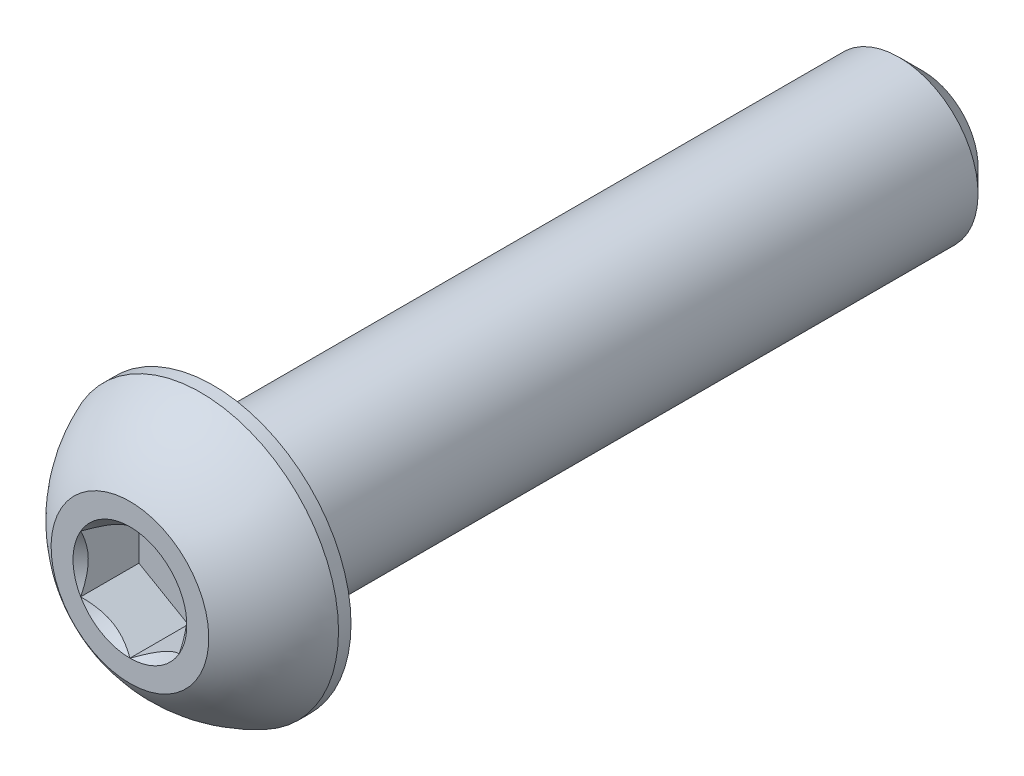
ISO-10303-21;
HEADER;
FILE_DESCRIPTION(('STEP AP214'),'2;1');
FILE_NAME('part.step','',(''),(''),'','','');
FILE_SCHEMA(('AUTOMOTIVE_DESIGN { 1 0 10303 214 1 1 1 1 }'));
ENDSEC;
DATA;
#1=APPLICATION_CONTEXT('core data for automotive mechanical design processes');
#2=APPLICATION_PROTOCOL_DEFINITION('international standard','automotive_design',2000,#1);
#3=PRODUCT_CONTEXT('',#1,'mechanical');
#4=PRODUCT('Part','Part','',(#3));
#5=PRODUCT_RELATED_PRODUCT_CATEGORY('part','',(#4));
#6=PRODUCT_DEFINITION_FORMATION('','',#4);
#7=PRODUCT_DEFINITION_CONTEXT('part definition',#1,'design');
#8=PRODUCT_DEFINITION('design','',#6,#7);
#9=PRODUCT_DEFINITION_SHAPE('','',#8);
#10=(LENGTH_UNIT() NAMED_UNIT(*) SI_UNIT(.MILLI.,.METRE.));
#11=(NAMED_UNIT(*) PLANE_ANGLE_UNIT() SI_UNIT($,.RADIAN.));
#12=(NAMED_UNIT(*) SI_UNIT($,.STERADIAN.) SOLID_ANGLE_UNIT());
#13=UNCERTAINTY_MEASURE_WITH_UNIT(LENGTH_MEASURE(1.E-05),#10,'distance_accuracy_value','');
#14=(GEOMETRIC_REPRESENTATION_CONTEXT(3) GLOBAL_UNCERTAINTY_ASSIGNED_CONTEXT((#13)) GLOBAL_UNIT_ASSIGNED_CONTEXT((#10,
#11,#12)) REPRESENTATION_CONTEXT('',''));
#15=CARTESIAN_POINT('',(0.,0.,0.));
#16=DIRECTION('',(0.,0.,1.));
#17=DIRECTION('',(1.,0.,0.));
#18=AXIS2_PLACEMENT_3D('',#15,#16,#17);
#19=CARTESIAN_POINT('',(0.,-3.175,-31.9278));
#20=DIRECTION('',(0.,0.,-1.));
#21=DIRECTION('',(0.,1.,0.));
#22=AXIS2_PLACEMENT_3D('',#19,#20,#21);
#23=PLANE('',#22);
#24=CARTESIAN_POINT('',(0.,0.,-31.9278));
#25=DIRECTION('',(0.,0.,-1.));
#26=DIRECTION('',(0.,1.,0.));
#27=AXIS2_PLACEMENT_3D('',#24,#25,#26);
#28=CIRCLE('',#27,2.22250000000001);
#29=CARTESIAN_POINT('',(0.,2.22250000000001,-31.9278));
#30=VERTEX_POINT('',#29);
#31=EDGE_CURVE('E173',#30,#30,#28,.T.);
#32=ORIENTED_EDGE('',*,*,#31,.T.);
#33=EDGE_LOOP('',(#32));
#34=FACE_BOUND('',#33,.T.);
#35=ADVANCED_FACE('F34',(#34),#23,.T.);
#36=CARTESIAN_POINT('',(0.,0.,-31.9278));
#37=DIRECTION('',(0.,0.,-1.));
#38=DIRECTION('',(0.,1.,0.));
#39=AXIS2_PLACEMENT_3D('',#36,#37,#38);
#40=CYLINDRICAL_SURFACE('',#39,3.175);
#41=CARTESIAN_POINT('',(0.,0.,-30.9753));
#42=DIRECTION('',(0.,0.,-1.));
#43=DIRECTION('',(0.,1.,0.));
#44=AXIS2_PLACEMENT_3D('',#41,#42,#43);
#45=CIRCLE('',#44,3.175);
#46=CARTESIAN_POINT('',(0.,3.175,-30.9753));
#47=VERTEX_POINT('',#46);
#48=EDGE_CURVE('E47',#47,#47,#45,.F.);
#49=ORIENTED_EDGE('',*,*,#48,.T.);
#50=EDGE_LOOP('',(#49));
#51=FACE_BOUND('',#50,.T.);
#52=CARTESIAN_POINT('',(0.,0.,-3.3528));
#53=DIRECTION('',(0.,0.,1.));
#54=DIRECTION('',(1.,0.,0.));
#55=AXIS2_PLACEMENT_3D('',#52,#53,#54);
#56=CIRCLE('',#55,3.175);
#57=CARTESIAN_POINT('',(3.175,0.,-3.3528));
#58=VERTEX_POINT('',#57);
#59=EDGE_CURVE('E170',#58,#58,#56,.F.);
#60=ORIENTED_EDGE('',*,*,#59,.T.);
#61=EDGE_LOOP('',(#60));
#62=FACE_BOUND('',#61,.T.);
#63=ADVANCED_FACE('F178',(#51,#62),#40,.T.);
#64=CARTESIAN_POINT('',(0.,0.,-31.9278));
#65=DIRECTION('',(0.,0.,1.));
#66=DIRECTION('',(0.,-1.,0.));
#67=AXIS2_PLACEMENT_3D('',#64,#65,#66);
#68=CONICAL_SURFACE('',#67,2.22250000000001,0.785398163397444);
#69=ORIENTED_EDGE('',*,*,#48,.F.);
#70=EDGE_LOOP('',(#69));
#71=FACE_BOUND('',#70,.T.);
#72=ORIENTED_EDGE('',*,*,#31,.F.);
#73=EDGE_LOOP('',(#72));
#74=FACE_BOUND('',#73,.T.);
#75=ADVANCED_FACE('F36',(#71,#74),#68,.T.);
#76=CARTESIAN_POINT('',(0.,0.,-5.060315));
#77=DIRECTION('',(0.,0.,1.));
#78=DIRECTION('',(0.,-1.,0.));
#79=AXIS2_PLACEMENT_3D('',#76,#77,#78);
#80=SPHERICAL_SURFACE('',#79,5.97389428256184);
#81=CARTESIAN_POINT('',(0.,0.,0.));
#82=DIRECTION('',(0.,0.,1.));
#83=DIRECTION('',(1.,0.,0.));
#84=AXIS2_PLACEMENT_3D('',#81,#82,#83);
#85=CIRCLE('',#84,3.175);
#86=CARTESIAN_POINT('',(0.,-3.175,0.));
#87=VERTEX_POINT('',#86);
#88=EDGE_CURVE('E167',#87,#87,#85,.T.);
#89=CARTESIAN_POINT('',(0.,0.,-2.84988));
#90=DIRECTION('',(0.,0.,1.));
#91=DIRECTION('',(1.,0.,0.));
#92=AXIS2_PLACEMENT_3D('',#89,#90,#91);
#93=CIRCLE('',#92,5.5499);
#94=CARTESIAN_POINT('',(0.,-5.5499,-2.84988));
#95=VERTEX_POINT('',#94);
#96=EDGE_CURVE('E161',#95,#95,#93,.T.);
#97=CARTESIAN_POINT('',(0.,-3.175,0.));
#98=CARTESIAN_POINT('',(0.,-3.20828343957184,-0.0208830076580488));
#99=CARTESIAN_POINT('',(0.,-3.24136078860705,-0.0420944789280492));
#100=CARTESIAN_POINT('',(0.,-3.3070905577514,-0.0851658910984713));
#101=CARTESIAN_POINT('',(0.,-3.33974297786056,-0.107025831998893));
#102=CARTESIAN_POINT('',(0.,-3.40461014130008,-0.151385725836676));
#103=CARTESIAN_POINT('',(0.,-3.43682488463043,-0.173885678774038));
#104=CARTESIAN_POINT('',(0.,-3.50080416139461,-0.219516822259478));
#105=CARTESIAN_POINT('',(0.,-3.53256869482844,-0.242648012807557));
#106=CARTESIAN_POINT('',(0.,-3.59563518208834,-0.289532629449102));
#107=CARTESIAN_POINT('',(0.,-3.62693713591442,-0.313286055542568));
#108=CARTESIAN_POINT('',(0.,-3.68906627753106,-0.361405894091329));
#109=CARTESIAN_POINT('',(0.,-3.71989346532163,-0.385772306546625));
#110=CARTESIAN_POINT('',(0.,-3.78106107243204,-0.435108631276876));
#111=CARTESIAN_POINT('',(0.,-3.81140149175189,-0.460078543551832));
#112=CARTESIAN_POINT('',(0.,-3.87158374923259,-0.510612146063937));
#113=CARTESIAN_POINT('',(0.,-3.90142558739343,-0.536175836301086));
#114=CARTESIAN_POINT('',(0.,-3.96059906392414,-0.587887041792083));
#115=CARTESIAN_POINT('',(0.,-3.989930702294,-0.614034557045931));
#116=CARTESIAN_POINT('',(0.,-4.04807235926832,-0.666903232293406));
#117=CARTESIAN_POINT('',(0.,-4.07688237787279,-0.693624392287033));
#118=CARTESIAN_POINT('',(0.,-4.13396957842491,-0.747629953401057));
#119=CARTESIAN_POINT('',(0.,-4.16224676037256,-0.774914354521453));
#120=CARTESIAN_POINT('',(0.,-4.21825727817542,-0.830035774981947));
#121=CARTESIAN_POINT('',(0.,-4.24599061403061,-0.857872794322044));
#122=CARTESIAN_POINT('',(0.,-4.30090264195357,-0.91408861315902));
#123=CARTESIAN_POINT('',(0.,-4.32808133402134,-0.942467412655899));
#124=CARTESIAN_POINT('',(0.,-4.38187349261952,-0.999755742806741));
#125=CARTESIAN_POINT('',(0.,-4.40848695914995,-1.0286652734607));
#126=CARTESIAN_POINT('',(0.,-4.46113830498838,-1.08700381029123));
#127=CARTESIAN_POINT('',(0.,-4.48717618429639,-1.11643281646778));
#128=CARTESIAN_POINT('',(0.,-4.53866621810402,-1.17579884645643));
#129=CARTESIAN_POINT('',(0.,-4.56411837260364,-1.20573587026853));
#130=CARTESIAN_POINT('',(0.,-4.61442704725457,-1.26610627984964));
#131=CARTESIAN_POINT('',(0.,-4.63928356740587,-1.29653966561866));
#132=CARTESIAN_POINT('',(0.,-4.68839129572448,-1.3578909501815));
#133=CARTESIAN_POINT('',(0.,-4.71264250389178,-1.38880884897531));
#134=CARTESIAN_POINT('',(0.,-4.76053016627881,-1.45111712201534));
#135=CARTESIAN_POINT('',(0.,-4.78416662049853,-1.48250749626155));
#136=CARTESIAN_POINT('',(0.,-4.8308155723751,-1.54574849868041));
#137=CARTESIAN_POINT('',(0.,-4.85382807003194,-1.57759912685306));
#138=CARTESIAN_POINT('',(0.,-4.89922014909859,-1.64174823640362));
#139=CARTESIAN_POINT('',(0.,-4.92159973050841,-1.67404671778154));
#140=CARTESIAN_POINT('',(0.,-4.96571726381658,-1.73907895865427));
#141=CARTESIAN_POINT('',(0.,-4.98745521571493,-1.77181271814908));
#142=CARTESIAN_POINT('',(0.,-5.03028102654719,-1.83770277069632));
#143=CARTESIAN_POINT('',(0.,-5.0513688854811,-1.87085906374874));
#144=CARTESIAN_POINT('',(0.,-5.09288630004063,-1.93758127434189));
#145=CARTESIAN_POINT('',(0.,-5.11331585566624,-1.97114719188261));
#146=CARTESIAN_POINT('',(0.,-5.15350870956168,-2.03867558290299));
#147=CARTESIAN_POINT('',(0.,-5.17327200783151,-2.07263805638265));
#148=CARTESIAN_POINT('',(0.,-5.21212465239608,-2.14094633632486));
#149=CARTESIAN_POINT('',(0.,-5.23121399869082,-2.17529214278741));
#150=CARTESIAN_POINT('',(0.,-5.26871130697935,-2.2443537165359));
#151=CARTESIAN_POINT('',(0.,-5.28711926897315,-2.27906948382184));
#152=CARTESIAN_POINT('',(0.,-5.32324664200827,-2.3488574628552));
#153=CARTESIAN_POINT('',(0.,-5.3409660530496,-2.38392967460262));
#154=CARTESIAN_POINT('',(0.,-5.37570942417474,-2.45441688802313));
#155=CARTESIAN_POINT('',(0.,-5.39273338425856,-2.48983188969622));
#156=CARTESIAN_POINT('',(0.,-5.42607922958184,-2.56099089271574));
#157=CARTESIAN_POINT('',(0.,-5.44240111482132,-2.59673489406217));
#158=CARTESIAN_POINT('',(0.,-5.47433643994316,-2.66853798649801));
#159=CARTESIAN_POINT('',(0.,-5.48994987982553,-2.70459707758742));
#160=CARTESIAN_POINT('',(0.,-5.52046229408188,-2.77701628549785));
#161=CARTESIAN_POINT('',(0.,-5.53536126845586,-2.81337640231887));
#162=CARTESIAN_POINT('',(0.,-5.5499,-2.84988));
#163=B_SPLINE_CURVE_WITH_KNOTS('',3,(#97,#98,#99,#100,#101,#102,#103,#104,#105,#106,#107,#108,
#109,#110,#111,#112,#113,#114,#115,#116,#117,#118,#119,#120,#121,#122,#123,#124,#125,#126,#127,
#128,#129,#130,#131,#132,#133,#134,#135,#136,#137,#138,#139,#140,#141,#142,#143,#144,#145,#146,
#147,#148,#149,#150,#151,#152,#153,#154,#155,#156,#157,#158,#159,#160,#161,#162),.UNSPECIFIED.,
.F.,.F.,(4,2,2,2,2,2,2,2,2,2,2,2,2,2,2,2,2,2,2,2,2,2,2,2,2,2,2,2,2,2,2,2,4),(0.,0.1178750807537,
0.2357501615074,0.353625242261099,0.471500323014799,0.589375403768499,0.707250484522198,
0.825125565275897,0.943000646029598,1.0608757267833,1.178750807537,1.2966258882907,
1.41450096904439,1.53237604979809,1.65025113055179,1.76812621130549,1.88600129205919,
2.00387637281289,2.12175145356659,2.23962653432029,2.35750161507399,2.47537669582769,
2.59325177658139,2.71112685733509,2.82900193808879,2.94687701884249,3.06475209959619,
3.18262718034989,3.30050226110359,3.41837734185729,3.53625242261099,3.65412750336469,
3.77200258411839),.UNSPECIFIED.);
#164=EDGE_CURVE('BSEAM183',#87,#95,#163,.T.);
#165=ORIENTED_EDGE('',*,*,#88,.F.);
#166=ORIENTED_EDGE('',*,*,#96,.T.);
#167=ORIENTED_EDGE('',*,*,#164,.T.);
#168=ORIENTED_EDGE('',*,*,#164,.F.);
#169=EDGE_LOOP('',(#165,#167,#166,#168));
#170=FACE_BOUND('',#169,.T.);
#171=ADVANCED_FACE('F183',(#170),#80,.T.);
#172=CARTESIAN_POINT('',(0.,-3.175,0.));
#173=DIRECTION('',(0.,0.,-1.));
#174=DIRECTION('',(-1.,0.,0.));
#175=AXIS2_PLACEMENT_3D('',#172,#173,#174);
#176=PLANE('',#175);
#177=CARTESIAN_POINT('',(0.,0.,0.));
#178=DIRECTION('',(0.,0.,1.));
#179=DIRECTION('',(1.,0.,0.));
#180=AXIS2_PLACEMENT_3D('',#177,#178,#179);
#181=CIRCLE('',#180,2.29135888084633);
#182=CARTESIAN_POINT('',(-1.984375,1.14567944042316,0.));
#183=VERTEX_POINT('',#182);
#184=CARTESIAN_POINT('',(-1.984375,-1.14567944042316,0.));
#185=VERTEX_POINT('',#184);
#186=EDGE_CURVE('E60',#183,#185,#181,.T.);
#187=ORIENTED_EDGE('',*,*,#186,.F.);
#188=CARTESIAN_POINT('',(0.,2.29135888084633,0.));
#189=VERTEX_POINT('',#188);
#190=EDGE_CURVE('E132',#189,#183,#181,.T.);
#191=ORIENTED_EDGE('',*,*,#190,.F.);
#192=CARTESIAN_POINT('',(1.984375,1.14567944042316,0.));
#193=VERTEX_POINT('',#192);
#194=EDGE_CURVE('E129',#193,#189,#181,.T.);
#195=ORIENTED_EDGE('',*,*,#194,.F.);
#196=CARTESIAN_POINT('',(1.984375,-1.14567944042316,0.));
#197=VERTEX_POINT('',#196);
#198=EDGE_CURVE('E100',#197,#193,#181,.T.);
#199=ORIENTED_EDGE('',*,*,#198,.F.);
#200=CARTESIAN_POINT('',(0.,-2.29135888084633,0.));
#201=VERTEX_POINT('',#200);
#202=EDGE_CURVE('E92',#201,#197,#181,.T.);
#203=ORIENTED_EDGE('',*,*,#202,.F.);
#204=EDGE_CURVE('E53',#185,#201,#181,.T.);
#205=ORIENTED_EDGE('',*,*,#204,.F.);
#206=EDGE_LOOP('',(#187,#191,#195,#199,#203,#205));
#207=FACE_BOUND('',#206,.T.);
#208=ORIENTED_EDGE('',*,*,#88,.T.);
#209=EDGE_LOOP('',(#208));
#210=FACE_BOUND('',#209,.T.);
#211=ADVANCED_FACE('F126',(#207,#210),#176,.F.);
#212=CARTESIAN_POINT('',(0.,-5.5499,-3.3528));
#213=DIRECTION('',(0.,0.,1.));
#214=DIRECTION('',(1.,0.,0.));
#215=AXIS2_PLACEMENT_3D('',#212,#213,#214);
#216=PLANE('',#215);
#217=ORIENTED_EDGE('',*,*,#59,.F.);
#218=EDGE_LOOP('',(#217));
#219=FACE_BOUND('',#218,.T.);
#220=CARTESIAN_POINT('',(0.,0.,-3.3528));
#221=DIRECTION('',(0.,0.,1.));
#222=DIRECTION('',(1.,0.,0.));
#223=AXIS2_PLACEMENT_3D('',#220,#221,#222);
#224=CIRCLE('',#223,5.5499);
#225=CARTESIAN_POINT('',(5.5499,0.,-3.3528));
#226=VERTEX_POINT('',#225);
#227=EDGE_CURVE('E164',#226,#226,#224,.T.);
#228=ORIENTED_EDGE('',*,*,#227,.F.);
#229=EDGE_LOOP('',(#228));
#230=FACE_BOUND('',#229,.T.);
#231=ADVANCED_FACE('F197',(#219,#230),#216,.F.);
#232=CARTESIAN_POINT('',(0.,0.,0.));
#233=DIRECTION('',(0.,0.,1.));
#234=DIRECTION('',(1.,0.,0.));
#235=AXIS2_PLACEMENT_3D('',#232,#233,#234);
#236=CYLINDRICAL_SURFACE('',#235,5.5499);
#237=ORIENTED_EDGE('',*,*,#96,.F.);
#238=EDGE_LOOP('',(#237));
#239=FACE_BOUND('',#238,.T.);
#240=ORIENTED_EDGE('',*,*,#227,.T.);
#241=EDGE_LOOP('',(#240));
#242=FACE_BOUND('',#241,.T.);
#243=ADVANCED_FACE('F200',(#239,#242),#236,.T.);
#244=CARTESIAN_POINT('',(0.,0.,0.));
#245=DIRECTION('',(0.,0.,1.));
#246=DIRECTION('',(1.,0.,0.));
#247=AXIS2_PLACEMENT_3D('',#244,#245,#246);
#248=CONICAL_SURFACE('',#247,2.29135888084633,0.78539816339745);
#249=ORIENTED_EDGE('',*,*,#198,.T.);
#250=CARTESIAN_POINT('',(1.984375,-2.28495242157822,0.734984078816568));
#251=CARTESIAN_POINT('',(1.984375,-2.22931635455402,0.692986685550761));
#252=CARTESIAN_POINT('',(1.984375,-2.17336876548389,0.651396054076336));
#253=CARTESIAN_POINT('',(1.984375,-2.06072770258171,0.569208461471479));
#254=CARTESIAN_POINT('',(1.984375,-2.00403404503435,0.528611752405042));
#255=CARTESIAN_POINT('',(1.984375,-1.88936329173488,0.448303503174669));
#256=CARTESIAN_POINT('',(1.984375,-1.83137965519348,0.408601258813307));
#257=CARTESIAN_POINT('',(1.984375,-1.7144280213784,0.330685173401292));
#258=CARTESIAN_POINT('',(1.984375,-1.65546009407228,0.292471227194368));
#259=CARTESIAN_POINT('',(1.984375,-1.47005472306035,0.176252834013636));
#260=CARTESIAN_POINT('',(1.984375,-1.34163909427883,0.101347886872381));
#261=CARTESIAN_POINT('',(1.984375,-1.0784038470548,-0.0356697845602626));
#262=CARTESIAN_POINT('',(1.984375,-0.943607781407425,-0.0978256335176257));
#263=CARTESIAN_POINT('',(1.984375,-0.741275100444882,-0.173867421311381));
#264=CARTESIAN_POINT('',(1.984375,-0.676735408881095,-0.195691938673995));
#265=CARTESIAN_POINT('',(1.984375,-0.546098118112762,-0.234159536462205));
#266=CARTESIAN_POINT('',(1.984375,-0.480000411919956,-0.250802259934452));
#267=CARTESIAN_POINT('',(1.984375,-0.347746170028532,-0.277764619130277));
#268=CARTESIAN_POINT('',(1.984375,-0.281612071479123,-0.288192590264108));
#269=CARTESIAN_POINT('',(1.984375,-0.14863662005235,-0.302521852623404));
#270=CARTESIAN_POINT('',(1.984375,-0.0817953907393235,-0.306424265772614));
#271=CARTESIAN_POINT('',(1.984375,0.0495156750890646,-0.307412948667328));
#272=CARTESIAN_POINT('',(1.984375,0.113983775102992,-0.304740821124985));
#273=CARTESIAN_POINT('',(1.984375,0.242367515846177,-0.293260789502485));
#274=CARTESIAN_POINT('',(1.984375,0.30628310229592,-0.284452289360786));
#275=CARTESIAN_POINT('',(1.984375,0.434181040262184,-0.261030978667103));
#276=CARTESIAN_POINT('',(1.984375,0.498145026858309,-0.246319393767914));
#277=CARTESIAN_POINT('',(1.984375,0.624675616953007,-0.211873818587874));
#278=CARTESIAN_POINT('',(1.984375,0.687242336899689,-0.192140248550805));
#279=CARTESIAN_POINT('',(1.984375,0.884225483826087,-0.12258776276924));
#280=CARTESIAN_POINT('',(1.984375,1.01583674256468,-0.0648475887435035));
#281=CARTESIAN_POINT('',(1.984375,1.27288659242652,0.0635303365887973));
#282=CARTESIAN_POINT('',(1.984375,1.3983008827048,0.134214424919412));
#283=CARTESIAN_POINT('',(1.984375,1.57956687990221,0.244516663813198));
#284=CARTESIAN_POINT('',(1.984375,1.63738271299424,0.280969829475363));
#285=CARTESIAN_POINT('',(1.984375,1.75202215386201,0.355415963291704));
#286=CARTESIAN_POINT('',(1.984375,1.80884568601361,0.393409048078053));
#287=CARTESIAN_POINT('',(1.984375,1.92116923084255,0.470338808893089));
#288=CARTESIAN_POINT('',(1.984375,1.97667624512253,0.50926531303879));
#289=CARTESIAN_POINT('',(1.984375,2.08693170717166,0.588147746121385));
#290=CARTESIAN_POINT('',(1.984375,2.14168035934792,0.628103389024029));
#291=CARTESIAN_POINT('',(1.984375,2.19611149046622,0.668480611285425));
#292=B_SPLINE_CURVE_WITH_KNOTS('',3,(#250,#251,#252,#253,#254,#255,#256,#257,#258,#259,#260,
#261,#262,#263,#264,#265,#266,#267,#268,#269,#270,#271,#272,#273,#274,#275,#276,#277,#278,#279,
#280,#281,#282,#283,#284,#285,#286,#287,#288,#289,#290,#291),.UNSPECIFIED.,.F.,.F.,(4,2,2,2,2,2,
2,2,2,2,2,2,2,2,2,2,2,2,2,2,4),(0.,0.209126070008322,0.418304637356569,0.629103979977992,
0.839888401371185,1.28549951116127,1.72957750768351,1.93379389749971,2.13802435186698,
2.33858179514334,2.53910475350639,2.73236963400794,2.92565329006887,3.12231577097487,
3.31896180041345,3.74886295245172,4.18033428125362,4.3853601718029,4.59040161996382,
4.79377749165107,4.99709743524131),.UNSPECIFIED.);
#293=EDGE_CURVE('E11',#197,#193,#292,.T.);
#294=ORIENTED_EDGE('',*,*,#293,.F.);
#295=EDGE_LOOP('',(#249,#294));
#296=FACE_BOUND('',#295,.T.);
#297=ADVANCED_FACE('F104',(#296),#248,.F.);
#298=ORIENTED_EDGE('',*,*,#194,.T.);
#299=CARTESIAN_POINT('',(1.984575,1.14556397036933,0.000115478781843379));
#300=CARTESIAN_POINT('',(1.9163590048332,1.18494849354192,-0.0392371477360852));
#301=CARTESIAN_POINT('',(1.84700231489303,1.22499159714897,-0.0762786895538154));
#302=CARTESIAN_POINT('',(1.70557619954781,1.30664400291398,-0.144101141576677));
#303=CARTESIAN_POINT('',(1.63349332126322,1.34826107209555,-0.174844310908246));
#304=CARTESIAN_POINT('',(1.488141602734,1.43217992591557,-0.227508111188786));
#305=CARTESIAN_POINT('',(1.41490978751306,1.47446033414663,-0.249561124120036));
#306=CARTESIAN_POINT('',(1.26683381740529,1.55995203534886,-0.283538507056124));
#307=CARTESIAN_POINT('',(1.19199418724658,1.60316071596705,-0.295488243908272));
#308=CARTESIAN_POINT('',(1.06301458545618,1.6776271237807,-0.306269900918094));
#309=CARTESIAN_POINT('',(1.00904128422756,1.7087886237741,-0.30786610094093));
#310=CARTESIAN_POINT('',(0.901182881480199,1.77106070163465,-0.305178161134708));
#311=CARTESIAN_POINT('',(0.847297817514476,1.80217125782056,-0.300891959659541));
#312=CARTESIAN_POINT('',(0.740036461751395,1.86409863044402,-0.286683126986481));
#313=CARTESIAN_POINT('',(0.686660807239859,1.89491507894443,-0.276754189547727));
#314=CARTESIAN_POINT('',(0.580832482591103,1.95601509066828,-0.251804915725461));
#315=CARTESIAN_POINT('',(0.528379742028898,1.9862986945516,-0.236784969610512));
#316=CARTESIAN_POINT('',(0.394017661036351,2.06387267818152,-0.19219214836433));
#317=CARTESIAN_POINT('',(0.312941642841675,2.11068193911104,-0.159257004061668));
#318=CARTESIAN_POINT('',(0.19372669327016,2.17951072233758,-0.103657558797803));
#319=CARTESIAN_POINT('',(0.154440075613998,2.20219286161692,-0.0841224079481377));
#320=CARTESIAN_POINT('',(0.0765946381319466,2.24713694590237,-0.0432712618805983));
#321=CARTESIAN_POINT('',(0.0380353888983007,2.26939913882716,-0.0219563604316494));
#322=CARTESIAN_POINT('',(-0.000200000000000694,2.29147435090017,0.000115478781842942));
#323=B_SPLINE_CURVE_WITH_KNOTS('',3,(#299,#300,#301,#302,#303,#304,#305,#306,#307,#308,#309,
#310,#311,#312,#313,#314,#315,#316,#317,#318,#319,#320,#321,#322),.UNSPECIFIED.,.F.,.F.,(4,2,2,
2,2,2,2,2,2,2,2,4),(0.,0.264339630306627,0.530219665093694,0.791876416371461,1.05287424418109,
1.239639843932,1.42647091743852,1.61351120244035,1.8005371524754,2.09764209964316,
2.24579179873714,2.39385111134157),.UNSPECIFIED.);
#324=EDGE_CURVE('E131',#193,#189,#323,.T.);
#325=ORIENTED_EDGE('',*,*,#324,.F.);
#326=EDGE_LOOP('',(#298,#325));
#327=FACE_BOUND('',#326,.T.);
#328=ADVANCED_FACE('F280',(#327),#248,.F.);
#329=ORIENTED_EDGE('',*,*,#190,.T.);
#330=CARTESIAN_POINT('',(0.000199999999999584,2.29147435090017,0.000115478781843248));
#331=CARTESIAN_POINT('',(-0.0680159951668027,2.25208982772757,-0.0392371477360854));
#332=CARTESIAN_POINT('',(-0.137372685106966,2.21204672412052,-0.0762786895538155));
#333=CARTESIAN_POINT('',(-0.278798800452188,2.13039431835551,-0.144101141576677));
#334=CARTESIAN_POINT('',(-0.350881678736783,2.08877724917394,-0.174844310908246));
#335=CARTESIAN_POINT('',(-0.496233397266004,2.00485839535392,-0.227508111188786));
#336=CARTESIAN_POINT('',(-0.569465212486939,1.96257798712287,-0.249561124120036));
#337=CARTESIAN_POINT('',(-0.717541182594707,1.87708628592063,-0.283538507056124));
#338=CARTESIAN_POINT('',(-0.792380812753425,1.83387760530244,-0.295488243908272));
#339=CARTESIAN_POINT('',(-0.921360414543816,1.75941119748879,-0.306269900918094));
#340=CARTESIAN_POINT('',(-0.975333715772443,1.72824969749539,-0.307866100940931));
#341=CARTESIAN_POINT('',(-1.0831921185198,1.66597761963484,-0.305178161134708));
#342=CARTESIAN_POINT('',(-1.13707718248552,1.63486706344893,-0.300891959659541));
#343=CARTESIAN_POINT('',(-1.2443385382486,1.57293969082547,-0.286683126986481));
#344=CARTESIAN_POINT('',(-1.29771419276014,1.54212324232506,-0.276754189547727));
#345=CARTESIAN_POINT('',(-1.4035425174089,1.48102323060122,-0.251804915725462));
#346=CARTESIAN_POINT('',(-1.4559952579711,1.45073962671789,-0.236784969610512));
#347=CARTESIAN_POINT('',(-1.59035733896365,1.37316564308797,-0.19219214836433));
#348=CARTESIAN_POINT('',(-1.67143335715832,1.32635638215845,-0.159257004061668));
#349=CARTESIAN_POINT('',(-1.79064830672984,1.25752759893191,-0.103657558797804));
#350=CARTESIAN_POINT('',(-1.829934924386,1.23484545965257,-0.0841224079481378));
#351=CARTESIAN_POINT('',(-1.90778036186805,1.18990137536712,-0.0432712618805986));
#352=CARTESIAN_POINT('',(-1.9463396111017,1.16763918244233,-0.0219563604316498));
#353=CARTESIAN_POINT('',(-1.984575,1.14556397036933,0.000115478781842511));
#354=B_SPLINE_CURVE_WITH_KNOTS('',3,(#330,#331,#332,#333,#334,#335,#336,#337,#338,#339,#340,
#341,#342,#343,#344,#345,#346,#347,#348,#349,#350,#351,#352,#353),.UNSPECIFIED.,.F.,.F.,(4,2,2,
2,2,2,2,2,2,2,2,4),(0.,0.264339630306627,0.530219665093694,0.791876416371461,1.05287424418109,
1.239639843932,1.42647091743852,1.61351120244035,1.8005371524754,2.09764209964316,
2.24579179873714,2.39385111134157),.UNSPECIFIED.);
#355=EDGE_CURVE('E136',#189,#183,#354,.T.);
#356=ORIENTED_EDGE('',*,*,#355,.F.);
#357=EDGE_LOOP('',(#329,#356));
#358=FACE_BOUND('',#357,.T.);
#359=ADVANCED_FACE('F139',(#358),#248,.F.);
#360=ORIENTED_EDGE('',*,*,#186,.T.);
#361=CARTESIAN_POINT('',(-1.984375,-2.28495242157822,0.734984078816568));
#362=CARTESIAN_POINT('',(-1.984375,-2.22931635455402,0.692986685550762));
#363=CARTESIAN_POINT('',(-1.984375,-2.17336876548389,0.651396054076336));
#364=CARTESIAN_POINT('',(-1.984375,-2.06072770258171,0.569208461471479));
#365=CARTESIAN_POINT('',(-1.984375,-2.00403404503435,0.528611752405043));
#366=CARTESIAN_POINT('',(-1.984375,-1.88936329173489,0.448303503174669));
#367=CARTESIAN_POINT('',(-1.984375,-1.83137965519348,0.408601258813307));
#368=CARTESIAN_POINT('',(-1.984375,-1.7144280213784,0.330685173401292));
#369=CARTESIAN_POINT('',(-1.984375,-1.65546009407228,0.292471227194368));
#370=CARTESIAN_POINT('',(-1.984375,-1.47005472306035,0.176252834013636));
#371=CARTESIAN_POINT('',(-1.984375,-1.34163909427883,0.101347886872381));
#372=CARTESIAN_POINT('',(-1.984375,-1.0784038470548,-0.0356697845602625));
#373=CARTESIAN_POINT('',(-1.984375,-0.943607781407425,-0.0978256335176254));
#374=CARTESIAN_POINT('',(-1.984375,-0.741275100444882,-0.173867421311381));
#375=CARTESIAN_POINT('',(-1.984375,-0.676735408881095,-0.195691938673995));
#376=CARTESIAN_POINT('',(-1.984375,-0.546098118112762,-0.234159536462205));
#377=CARTESIAN_POINT('',(-1.984375,-0.480000411919956,-0.250802259934452));
#378=CARTESIAN_POINT('',(-1.984375,-0.347746170028532,-0.277764619130277));
#379=CARTESIAN_POINT('',(-1.984375,-0.281612071479123,-0.288192590264108));
#380=CARTESIAN_POINT('',(-1.984375,-0.14863662005235,-0.302521852623404));
#381=CARTESIAN_POINT('',(-1.984375,-0.0817953907393238,-0.306424265772614));
#382=CARTESIAN_POINT('',(-1.984375,0.0495156750890643,-0.307412948667328));
#383=CARTESIAN_POINT('',(-1.984375,0.113983775102991,-0.304740821124985));
#384=CARTESIAN_POINT('',(-1.984375,0.242367515846177,-0.293260789502485));
#385=CARTESIAN_POINT('',(-1.984375,0.306283102295919,-0.284452289360786));
#386=CARTESIAN_POINT('',(-1.984375,0.434181040262184,-0.261030978667103));
#387=CARTESIAN_POINT('',(-1.984375,0.498145026858309,-0.246319393767914));
#388=CARTESIAN_POINT('',(-1.984375,0.624675616953007,-0.211873818587874));
#389=CARTESIAN_POINT('',(-1.984375,0.687242336899689,-0.192140248550805));
#390=CARTESIAN_POINT('',(-1.984375,0.884225483826087,-0.12258776276924));
#391=CARTESIAN_POINT('',(-1.984375,1.01583674256468,-0.0648475887435032));
#392=CARTESIAN_POINT('',(-1.984375,1.27288659242652,0.0635303365887978));
#393=CARTESIAN_POINT('',(-1.984375,1.3983008827048,0.134214424919412));
#394=CARTESIAN_POINT('',(-1.984375,1.57956687990221,0.244516663813198));
#395=CARTESIAN_POINT('',(-1.984375,1.63738271299424,0.280969829475363));
#396=CARTESIAN_POINT('',(-1.984375,1.75202215386202,0.355415963291704));
#397=CARTESIAN_POINT('',(-1.984375,1.80884568601362,0.393409048078053));
#398=CARTESIAN_POINT('',(-1.984375,1.92116923084255,0.47033880889309));
#399=CARTESIAN_POINT('',(-1.984375,1.97667624512253,0.509265313038791));
#400=CARTESIAN_POINT('',(-1.984375,2.08693170717166,0.588147746121386));
#401=CARTESIAN_POINT('',(-1.984375,2.14168035934793,0.628103389024029));
#402=CARTESIAN_POINT('',(-1.984375,2.19611149046622,0.668480611285426));
#403=B_SPLINE_CURVE_WITH_KNOTS('',3,(#361,#362,#363,#364,#365,#366,#367,#368,#369,#370,#371,
#372,#373,#374,#375,#376,#377,#378,#379,#380,#381,#382,#383,#384,#385,#386,#387,#388,#389,#390,
#391,#392,#393,#394,#395,#396,#397,#398,#399,#400,#401,#402),.UNSPECIFIED.,.F.,.F.,(4,2,2,2,2,2,
2,2,2,2,2,2,2,2,2,2,2,2,2,2,4),(0.,0.209126070008322,0.41830463735657,0.629103979977993,
0.839888401371186,1.28549951116127,1.72957750768351,1.93379389749972,2.13802435186698,
2.33858179514334,2.53910475350639,2.73236963400794,2.92565329006887,3.12231577097487,
3.31896180041345,3.74886295245172,4.18033428125362,4.3853601718029,4.59040161996383,
4.79377749165108,4.99709743524131),.UNSPECIFIED.);
#404=EDGE_CURVE('E143',#183,#185,#403,.F.);
#405=ORIENTED_EDGE('',*,*,#404,.F.);
#406=EDGE_LOOP('',(#360,#405));
#407=FACE_BOUND('',#406,.T.);
#408=ADVANCED_FACE('F274',(#407),#248,.F.);
#409=ORIENTED_EDGE('',*,*,#204,.T.);
#410=CARTESIAN_POINT('',(-1.984575,-1.14556397036933,0.000115478781842946));
#411=CARTESIAN_POINT('',(-1.9163590048332,-1.18494849354192,-0.0392371477360854));
#412=CARTESIAN_POINT('',(-1.84700231489303,-1.22499159714897,-0.0762786895538155));
#413=CARTESIAN_POINT('',(-1.70557619954781,-1.30664400291398,-0.144101141576677));
#414=CARTESIAN_POINT('',(-1.63349332126322,-1.34826107209555,-0.174844310908246));
#415=CARTESIAN_POINT('',(-1.488141602734,-1.43217992591557,-0.227508111188786));
#416=CARTESIAN_POINT('',(-1.41490978751306,-1.47446033414662,-0.249561124120036));
#417=CARTESIAN_POINT('',(-1.26683381740529,-1.55995203534886,-0.283538507056125));
#418=CARTESIAN_POINT('',(-1.19199418724658,-1.60316071596705,-0.295488243908272));
#419=CARTESIAN_POINT('',(-1.06301458545618,-1.6776271237807,-0.306269900918095));
#420=CARTESIAN_POINT('',(-1.00904128422756,-1.7087886237741,-0.307866100940931));
#421=CARTESIAN_POINT('',(-0.9011828814802,-1.77106070163465,-0.305178161134708));
#422=CARTESIAN_POINT('',(-0.847297817514477,-1.80217125782056,-0.300891959659541));
#423=CARTESIAN_POINT('',(-0.740036461751396,-1.86409863044402,-0.286683126986481));
#424=CARTESIAN_POINT('',(-0.68666080723986,-1.89491507894443,-0.276754189547728));
#425=CARTESIAN_POINT('',(-0.580832482591103,-1.95601509066827,-0.251804915725462));
#426=CARTESIAN_POINT('',(-0.528379742028898,-1.9862986945516,-0.236784969610513));
#427=CARTESIAN_POINT('',(-0.394017661036351,-2.06387267818152,-0.192192148364331));
#428=CARTESIAN_POINT('',(-0.312941642841675,-2.11068193911104,-0.159257004061668));
#429=CARTESIAN_POINT('',(-0.19372669327016,-2.17951072233758,-0.103657558797804));
#430=CARTESIAN_POINT('',(-0.154440075613998,-2.20219286161692,-0.0841224079481377));
#431=CARTESIAN_POINT('',(-0.0765946381319458,-2.24713694590237,-0.0432712618805983));
#432=CARTESIAN_POINT('',(-0.0380353888982999,-2.26939913882716,-0.0219563604316494));
#433=CARTESIAN_POINT('',(0.000200000000001552,-2.29147435090017,0.000115478781842944));
#434=B_SPLINE_CURVE_WITH_KNOTS('',3,(#410,#411,#412,#413,#414,#415,#416,#417,#418,#419,#420,
#421,#422,#423,#424,#425,#426,#427,#428,#429,#430,#431,#432,#433),.UNSPECIFIED.,.F.,.F.,(4,2,2,
2,2,2,2,2,2,2,2,4),(0.,0.264339630306627,0.530219665093694,0.79187641637146,1.05287424418109,
1.239639843932,1.42647091743852,1.61351120244035,1.8005371524754,2.09764209964316,
2.24579179873714,2.39385111134157),.UNSPECIFIED.);
#435=EDGE_CURVE('E116',#185,#201,#434,.T.);
#436=ORIENTED_EDGE('',*,*,#435,.F.);
#437=EDGE_LOOP('',(#409,#436));
#438=FACE_BOUND('',#437,.T.);
#439=ADVANCED_FACE('F225',(#438),#248,.F.);
#440=ORIENTED_EDGE('',*,*,#202,.T.);
#441=CARTESIAN_POINT('',(-0.000199999999998723,-2.29147435090017,0.000115478781843248));
#442=CARTESIAN_POINT('',(0.0680159951668037,-2.25208982772757,-0.0392371477360849));
#443=CARTESIAN_POINT('',(0.137372685106967,-2.21204672412052,-0.076278689553815));
#444=CARTESIAN_POINT('',(0.278798800452189,-2.13039431835551,-0.144101141576677));
#445=CARTESIAN_POINT('',(0.350881678736784,-2.08877724917394,-0.174844310908246));
#446=CARTESIAN_POINT('',(0.496233397266005,-2.00485839535392,-0.227508111188786));
#447=CARTESIAN_POINT('',(0.56946521248694,-1.96257798712287,-0.249561124120036));
#448=CARTESIAN_POINT('',(0.717541182594708,-1.87708628592063,-0.283538507056124));
#449=CARTESIAN_POINT('',(0.792380812753426,-1.83387760530244,-0.295488243908271));
#450=CARTESIAN_POINT('',(0.921360414543817,-1.75941119748879,-0.306269900918094));
#451=CARTESIAN_POINT('',(0.975333715772444,-1.72824969749539,-0.30786610094093));
#452=CARTESIAN_POINT('',(1.0831921185198,-1.66597761963484,-0.305178161134707));
#453=CARTESIAN_POINT('',(1.13707718248553,-1.63486706344893,-0.30089195965954));
#454=CARTESIAN_POINT('',(1.24433853824861,-1.57293969082547,-0.286683126986481));
#455=CARTESIAN_POINT('',(1.29771419276014,-1.54212324232506,-0.276754189547727));
#456=CARTESIAN_POINT('',(1.4035425174089,-1.48102323060122,-0.251804915725461));
#457=CARTESIAN_POINT('',(1.4559952579711,-1.45073962671789,-0.236784969610511));
#458=CARTESIAN_POINT('',(1.59035733896365,-1.37316564308797,-0.192192148364329));
#459=CARTESIAN_POINT('',(1.67143335715833,-1.32635638215845,-0.159257004061667));
#460=CARTESIAN_POINT('',(1.79064830672984,-1.25752759893191,-0.103657558797803));
#461=CARTESIAN_POINT('',(1.829934924386,-1.23484545965257,-0.0841224079481373));
#462=CARTESIAN_POINT('',(1.90778036186805,-1.18990137536712,-0.0432712618805982));
#463=CARTESIAN_POINT('',(1.9463396111017,-1.16763918244233,-0.0219563604316493));
#464=CARTESIAN_POINT('',(1.984575,-1.14556397036933,0.000115478781843057));
#465=B_SPLINE_CURVE_WITH_KNOTS('',3,(#441,#442,#443,#444,#445,#446,#447,#448,#449,#450,#451,
#452,#453,#454,#455,#456,#457,#458,#459,#460,#461,#462,#463,#464),.UNSPECIFIED.,.F.,.F.,(4,2,2,
2,2,2,2,2,2,2,2,4),(0.,0.264339630306627,0.530219665093694,0.791876416371461,1.05287424418109,
1.239639843932,1.42647091743852,1.61351120244035,1.8005371524754,2.09764209964316,
2.24579179873714,2.39385111134157),.UNSPECIFIED.);
#466=EDGE_CURVE('E96',#201,#197,#465,.T.);
#467=ORIENTED_EDGE('',*,*,#466,.F.);
#468=EDGE_LOOP('',(#440,#467));
#469=FACE_BOUND('',#468,.T.);
#470=ADVANCED_FACE('F94',(#469),#248,.F.);
#471=CARTESIAN_POINT('',(1.984375,-1.14567944042316,-2.34696));
#472=DIRECTION('',(0.,0.,1.));
#473=DIRECTION('',(1.,0.,0.));
#474=AXIS2_PLACEMENT_3D('',#471,#472,#473);
#475=PLANE('',#474);
#476=DIRECTION('',(0.866025403784438,0.5,0.));
#477=VECTOR('',#476,1.);
#478=CARTESIAN_POINT('',(0.,-2.29135888084633,-2.34696));
#479=LINE('',#478,#477);
#480=CARTESIAN_POINT('',(0.,-2.29135888084633,-2.34696));
#481=VERTEX_POINT('',#480);
#482=CARTESIAN_POINT('',(1.984375,-1.14567944042316,-2.34696));
#483=VERTEX_POINT('',#482);
#484=EDGE_CURVE('E115',#481,#483,#479,.T.);
#485=ORIENTED_EDGE('',*,*,#484,.T.);
#486=DIRECTION('',(0.,1.,0.));
#487=VECTOR('',#486,1.);
#488=CARTESIAN_POINT('',(1.984375,-1.14567944042316,-2.34696));
#489=LINE('',#488,#487);
#490=CARTESIAN_POINT('',(1.984375,1.14567944042316,-2.34696));
#491=VERTEX_POINT('',#490);
#492=EDGE_CURVE('E120',#483,#491,#489,.T.);
#493=ORIENTED_EDGE('',*,*,#492,.T.);
#494=DIRECTION('',(-0.866025403784439,0.5,0.));
#495=VECTOR('',#494,1.);
#496=CARTESIAN_POINT('',(1.984375,1.14567944042316,-2.34696));
#497=LINE('',#496,#495);
#498=CARTESIAN_POINT('',(0.,2.29135888084633,-2.34696));
#499=VERTEX_POINT('',#498);
#500=EDGE_CURVE('E264',#491,#499,#497,.T.);
#501=ORIENTED_EDGE('',*,*,#500,.T.);
#502=DIRECTION('',(-0.866025403784438,-0.5,0.));
#503=VECTOR('',#502,1.);
#504=CARTESIAN_POINT('',(0.,2.29135888084633,-2.34696));
#505=LINE('',#504,#503);
#506=CARTESIAN_POINT('',(-1.984375,1.14567944042316,-2.34696));
#507=VERTEX_POINT('',#506);
#508=EDGE_CURVE('E152',#499,#507,#505,.T.);
#509=ORIENTED_EDGE('',*,*,#508,.T.);
#510=DIRECTION('',(0.,-1.,0.));
#511=VECTOR('',#510,1.);
#512=CARTESIAN_POINT('',(-1.984375,1.14567944042316,-2.34696));
#513=LINE('',#512,#511);
#514=CARTESIAN_POINT('',(-1.984375,-1.14567944042316,-2.34696));
#515=VERTEX_POINT('',#514);
#516=EDGE_CURVE('E268',#507,#515,#513,.T.);
#517=ORIENTED_EDGE('',*,*,#516,.T.);
#518=DIRECTION('',(0.866025403784439,-0.5,0.));
#519=VECTOR('',#518,1.);
#520=CARTESIAN_POINT('',(-1.984375,-1.14567944042316,-2.34696));
#521=LINE('',#520,#519);
#522=EDGE_CURVE('E123',#515,#481,#521,.T.);
#523=ORIENTED_EDGE('',*,*,#522,.T.);
#524=EDGE_LOOP('',(#485,#493,#501,#509,#517,#523));
#525=FACE_BOUND('',#524,.T.);
#526=ADVANCED_FACE('F224',(#525),#475,.T.);
#527=CARTESIAN_POINT('',(1.984375,-1.14567944042316,-2.34696));
#528=DIRECTION('',(1.,0.,0.));
#529=DIRECTION('',(0.,0.,-1.));
#530=AXIS2_PLACEMENT_3D('',#527,#528,#529);
#531=PLANE('',#530);
#532=DIRECTION('',(0.,0.,1.));
#533=VECTOR('',#532,1.);
#534=CARTESIAN_POINT('',(1.984375,-1.14567944042316,-2.34696));
#535=LINE('',#534,#533);
#536=EDGE_CURVE('E112',#483,#197,#535,.T.);
#537=ORIENTED_EDGE('',*,*,#536,.T.);
#538=ORIENTED_EDGE('',*,*,#293,.T.);
#539=DIRECTION('',(0.,0.,1.));
#540=VECTOR('',#539,1.);
#541=CARTESIAN_POINT('',(1.984375,1.14567944042316,-2.34696));
#542=LINE('',#541,#540);
#543=EDGE_CURVE('E122',#491,#193,#542,.T.);
#544=ORIENTED_EDGE('',*,*,#543,.F.);
#545=ORIENTED_EDGE('',*,*,#492,.F.);
#546=EDGE_LOOP('',(#537,#538,#544,#545));
#547=FACE_BOUND('',#546,.T.);
#548=ADVANCED_FACE('F118',(#547),#531,.F.);
#549=CARTESIAN_POINT('',(1.984375,1.14567944042316,-2.34696));
#550=DIRECTION('',(0.5,0.866025403784439,0.));
#551=DIRECTION('',(-0.866025403784439,0.5,0.));
#552=AXIS2_PLACEMENT_3D('',#549,#550,#551);
#553=PLANE('',#552);
#554=ORIENTED_EDGE('',*,*,#543,.T.);
#555=ORIENTED_EDGE('',*,*,#324,.T.);
#556=DIRECTION('',(0.,0.,1.));
#557=VECTOR('',#556,1.);
#558=CARTESIAN_POINT('',(0.,2.29135888084633,-2.34696));
#559=LINE('',#558,#557);
#560=EDGE_CURVE('E148',#499,#189,#559,.T.);
#561=ORIENTED_EDGE('',*,*,#560,.F.);
#562=ORIENTED_EDGE('',*,*,#500,.F.);
#563=EDGE_LOOP('',(#554,#555,#561,#562));
#564=FACE_BOUND('',#563,.T.);
#565=ADVANCED_FACE('F146',(#564),#553,.F.);
#566=CARTESIAN_POINT('',(0.,2.29135888084633,-2.34696));
#567=DIRECTION('',(-0.5,0.866025403784438,0.));
#568=DIRECTION('',(-0.866025403784438,-0.5,0.));
#569=AXIS2_PLACEMENT_3D('',#566,#567,#568);
#570=PLANE('',#569);
#571=ORIENTED_EDGE('',*,*,#560,.T.);
#572=ORIENTED_EDGE('',*,*,#355,.T.);
#573=DIRECTION('',(0.,0.,1.));
#574=VECTOR('',#573,1.);
#575=CARTESIAN_POINT('',(-1.984375,1.14567944042316,-2.34696));
#576=LINE('',#575,#574);
#577=EDGE_CURVE('E154',#507,#183,#576,.T.);
#578=ORIENTED_EDGE('',*,*,#577,.F.);
#579=ORIENTED_EDGE('',*,*,#508,.F.);
#580=EDGE_LOOP('',(#571,#572,#578,#579));
#581=FACE_BOUND('',#580,.T.);
#582=ADVANCED_FACE('F150',(#581),#570,.F.);
#583=CARTESIAN_POINT('',(-1.984375,1.14567944042316,-2.34696));
#584=DIRECTION('',(-1.,0.,0.));
#585=DIRECTION('',(0.,0.,1.));
#586=AXIS2_PLACEMENT_3D('',#583,#584,#585);
#587=PLANE('',#586);
#588=ORIENTED_EDGE('',*,*,#577,.T.);
#589=ORIENTED_EDGE('',*,*,#404,.T.);
#590=DIRECTION('',(0.,0.,1.));
#591=VECTOR('',#590,1.);
#592=CARTESIAN_POINT('',(-1.984375,-1.14567944042316,-2.34696));
#593=LINE('',#592,#591);
#594=EDGE_CURVE('E156',#515,#185,#593,.T.);
#595=ORIENTED_EDGE('',*,*,#594,.F.);
#596=ORIENTED_EDGE('',*,*,#516,.F.);
#597=EDGE_LOOP('',(#588,#589,#595,#596));
#598=FACE_BOUND('',#597,.T.);
#599=ADVANCED_FACE('F243',(#598),#587,.F.);
#600=CARTESIAN_POINT('',(-1.984375,-1.14567944042316,-2.34696));
#601=DIRECTION('',(-0.5,-0.866025403784439,0.));
#602=DIRECTION('',(0.866025403784439,-0.5,0.));
#603=AXIS2_PLACEMENT_3D('',#600,#601,#602);
#604=PLANE('',#603);
#605=ORIENTED_EDGE('',*,*,#594,.T.);
#606=ORIENTED_EDGE('',*,*,#435,.T.);
#607=DIRECTION('',(0.,0.,1.));
#608=VECTOR('',#607,1.);
#609=CARTESIAN_POINT('',(0.,-2.29135888084633,-2.34696));
#610=LINE('',#609,#608);
#611=EDGE_CURVE('E114',#481,#201,#610,.T.);
#612=ORIENTED_EDGE('',*,*,#611,.F.);
#613=ORIENTED_EDGE('',*,*,#522,.F.);
#614=EDGE_LOOP('',(#605,#606,#612,#613));
#615=FACE_BOUND('',#614,.T.);
#616=ADVANCED_FACE('F207',(#615),#604,.F.);
#617=CARTESIAN_POINT('',(0.,-2.29135888084633,-2.34696));
#618=DIRECTION('',(0.5,-0.866025403784438,0.));
#619=DIRECTION('',(0.866025403784438,0.5,0.));
#620=AXIS2_PLACEMENT_3D('',#617,#618,#619);
#621=PLANE('',#620);
#622=ORIENTED_EDGE('',*,*,#611,.T.);
#623=ORIENTED_EDGE('',*,*,#466,.T.);
#624=ORIENTED_EDGE('',*,*,#536,.F.);
#625=ORIENTED_EDGE('',*,*,#484,.F.);
#626=EDGE_LOOP('',(#622,#623,#624,#625));
#627=FACE_BOUND('',#626,.T.);
#628=ADVANCED_FACE('F110',(#627),#621,.F.);
#629=CLOSED_SHELL('',(#35,#63,#75,#171,#211,#231,#243,#297,#328,#359,#408,#439,#470,#526,#548,
#565,#582,#599,#616,#628));
#630=MANIFOLD_SOLID_BREP('B2',#629);
#631=ADVANCED_BREP_SHAPE_REPRESENTATION('',(#18,#630),#14);
#632=SHAPE_DEFINITION_REPRESENTATION(#9,#631);
ENDSEC;
END-ISO-10303-21;
